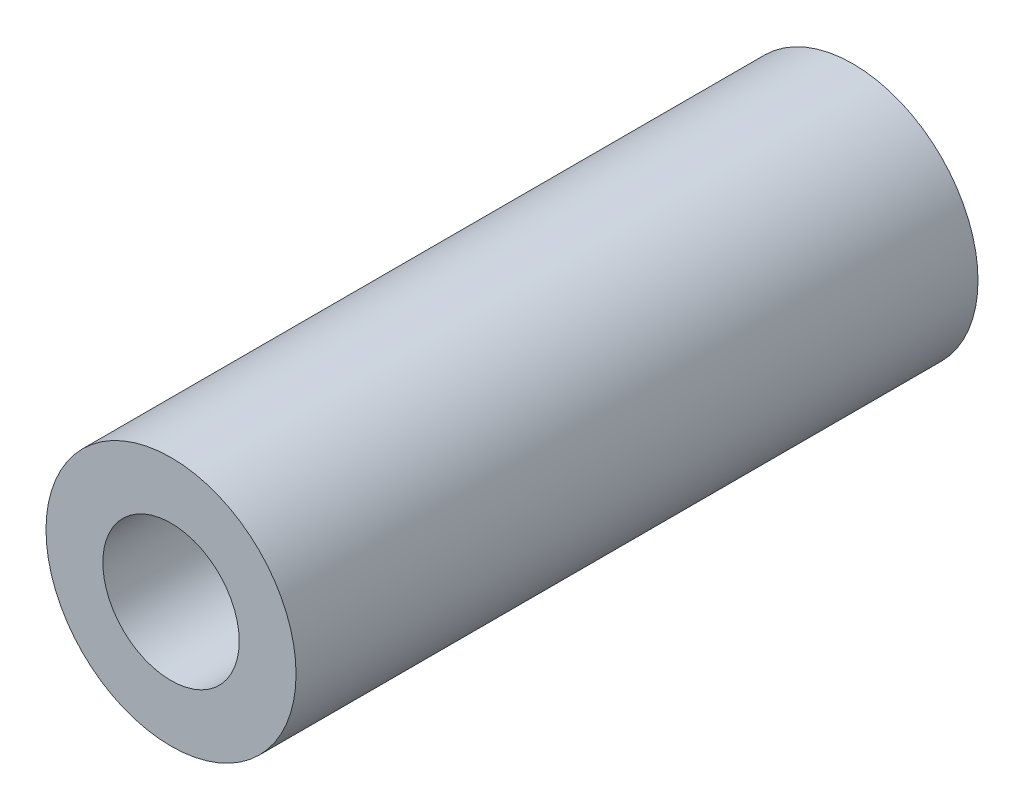
ISO-10303-21;
HEADER;
FILE_DESCRIPTION(('STEP AP214'),'2;1');
FILE_NAME('part.step','',(''),(''),'','','');
FILE_SCHEMA(('AUTOMOTIVE_DESIGN { 1 0 10303 214 1 1 1 1 }'));
ENDSEC;
DATA;
#1=APPLICATION_CONTEXT('core data for automotive mechanical design processes');
#2=APPLICATION_PROTOCOL_DEFINITION('international standard','automotive_design',2000,#1);
#3=PRODUCT_CONTEXT('',#1,'mechanical');
#4=PRODUCT('Part','Part','',(#3));
#5=PRODUCT_RELATED_PRODUCT_CATEGORY('part','',(#4));
#6=PRODUCT_DEFINITION_FORMATION('','',#4);
#7=PRODUCT_DEFINITION_CONTEXT('part definition',#1,'design');
#8=PRODUCT_DEFINITION('design','',#6,#7);
#9=PRODUCT_DEFINITION_SHAPE('','',#8);
#10=(LENGTH_UNIT() NAMED_UNIT(*) SI_UNIT(.MILLI.,.METRE.));
#11=(NAMED_UNIT(*) PLANE_ANGLE_UNIT() SI_UNIT($,.RADIAN.));
#12=(NAMED_UNIT(*) SI_UNIT($,.STERADIAN.) SOLID_ANGLE_UNIT());
#13=UNCERTAINTY_MEASURE_WITH_UNIT(LENGTH_MEASURE(1.E-05),#10,'distance_accuracy_value','');
#14=(GEOMETRIC_REPRESENTATION_CONTEXT(3) GLOBAL_UNCERTAINTY_ASSIGNED_CONTEXT((#13)) GLOBAL_UNIT_ASSIGNED_CONTEXT((#10,
#11,#12)) REPRESENTATION_CONTEXT('',''));
#15=CARTESIAN_POINT('',(0.,0.,0.));
#16=DIRECTION('',(0.,0.,1.));
#17=DIRECTION('',(1.,0.,0.));
#18=AXIS2_PLACEMENT_3D('',#15,#16,#17);
#19=CARTESIAN_POINT('',(0.,0.,60.));
#20=DIRECTION('',(0.,0.,1.));
#21=DIRECTION('',(1.,0.,0.));
#22=AXIS2_PLACEMENT_3D('',#19,#20,#21);
#23=PLANE('',#22);
#24=CARTESIAN_POINT('',(0.,0.,60.));
#25=DIRECTION('',(0.,0.,1.));
#26=DIRECTION('',(1.,0.,0.));
#27=AXIS2_PLACEMENT_3D('',#24,#25,#26);
#28=CIRCLE('',#27,11.);
#29=CARTESIAN_POINT('',(11.,0.,60.));
#30=VERTEX_POINT('',#29);
#31=EDGE_CURVE('E10',#30,#30,#28,.T.);
#32=ORIENTED_EDGE('',*,*,#31,.T.);
#33=EDGE_LOOP('',(#32));
#34=FACE_BOUND('',#33,.T.);
#35=CARTESIAN_POINT('',(0.,0.,60.));
#36=DIRECTION('',(0.,0.,1.));
#37=DIRECTION('',(1.,0.,0.));
#38=AXIS2_PLACEMENT_3D('',#35,#36,#37);
#39=CIRCLE('',#38,6.);
#40=CARTESIAN_POINT('',(6.,0.,60.));
#41=VERTEX_POINT('',#40);
#42=EDGE_CURVE('E48',#41,#41,#39,.T.);
#43=ORIENTED_EDGE('',*,*,#42,.F.);
#44=EDGE_LOOP('',(#43));
#45=FACE_BOUND('',#44,.T.);
#46=ADVANCED_FACE('F40',(#34,#45),#23,.T.);
#47=CARTESIAN_POINT('',(0.,0.,0.));
#48=DIRECTION('',(0.,0.,1.));
#49=DIRECTION('',(1.,0.,0.));
#50=AXIS2_PLACEMENT_3D('',#47,#48,#49);
#51=PLANE('',#50);
#52=CARTESIAN_POINT('',(0.,0.,0.));
#53=DIRECTION('',(0.,0.,1.));
#54=DIRECTION('',(1.,0.,0.));
#55=AXIS2_PLACEMENT_3D('',#52,#53,#54);
#56=CIRCLE('',#55,11.);
#57=CARTESIAN_POINT('',(11.,0.,0.));
#58=VERTEX_POINT('',#57);
#59=EDGE_CURVE('E41',#58,#58,#56,.T.);
#60=ORIENTED_EDGE('',*,*,#59,.F.);
#61=EDGE_LOOP('',(#60));
#62=FACE_BOUND('',#61,.T.);
#63=CARTESIAN_POINT('',(0.,0.,0.));
#64=DIRECTION('',(0.,0.,1.));
#65=DIRECTION('',(1.,0.,0.));
#66=AXIS2_PLACEMENT_3D('',#63,#64,#65);
#67=CIRCLE('',#66,6.);
#68=CARTESIAN_POINT('',(6.,0.,0.));
#69=VERTEX_POINT('',#68);
#70=EDGE_CURVE('E49',#69,#69,#67,.T.);
#71=ORIENTED_EDGE('',*,*,#70,.T.);
#72=EDGE_LOOP('',(#71));
#73=FACE_BOUND('',#72,.T.);
#74=ADVANCED_FACE('F58',(#62,#73),#51,.F.);
#75=CARTESIAN_POINT('',(0.,0.,60.));
#76=DIRECTION('',(0.,0.,-1.));
#77=DIRECTION('',(-1.,0.,0.));
#78=AXIS2_PLACEMENT_3D('',#75,#76,#77);
#79=CYLINDRICAL_SURFACE('',#78,11.);
#80=ORIENTED_EDGE('',*,*,#31,.F.);
#81=EDGE_LOOP('',(#80));
#82=FACE_BOUND('',#81,.T.);
#83=ORIENTED_EDGE('',*,*,#59,.T.);
#84=EDGE_LOOP('',(#83));
#85=FACE_BOUND('',#84,.T.);
#86=ADVANCED_FACE('F39',(#82,#85),#79,.T.);
#87=CARTESIAN_POINT('',(0.,0.,60.));
#88=DIRECTION('',(0.,0.,-1.));
#89=DIRECTION('',(-1.,0.,0.));
#90=AXIS2_PLACEMENT_3D('',#87,#88,#89);
#91=CYLINDRICAL_SURFACE('',#90,6.);
#92=ORIENTED_EDGE('',*,*,#42,.T.);
#93=EDGE_LOOP('',(#92));
#94=FACE_BOUND('',#93,.T.);
#95=ORIENTED_EDGE('',*,*,#70,.F.);
#96=EDGE_LOOP('',(#95));
#97=FACE_BOUND('',#96,.T.);
#98=ADVANCED_FACE('F57',(#94,#97),#91,.F.);
#99=CLOSED_SHELL('',(#46,#74,#86,#98));
#100=MANIFOLD_SOLID_BREP('B2',#99);
#101=ADVANCED_BREP_SHAPE_REPRESENTATION('',(#18,#100),#14);
#102=SHAPE_DEFINITION_REPRESENTATION(#9,#101);
ENDSEC;
END-ISO-10303-21;
